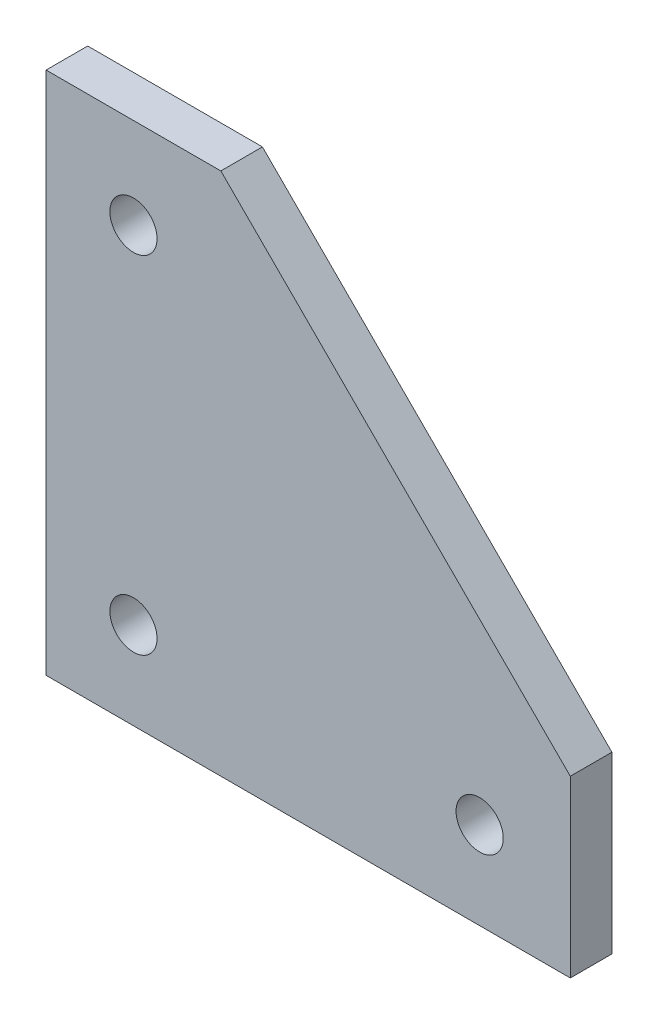
ISO-10303-21;
HEADER;
FILE_DESCRIPTION(('STEP AP214'),'2;1');
FILE_NAME('part.step','',(''),(''),'','','');
FILE_SCHEMA(('AUTOMOTIVE_DESIGN { 1 0 10303 214 1 1 1 1 }'));
ENDSEC;
DATA;
#1=APPLICATION_CONTEXT('core data for automotive mechanical design processes');
#2=APPLICATION_PROTOCOL_DEFINITION('international standard','automotive_design',2000,#1);
#3=PRODUCT_CONTEXT('',#1,'mechanical');
#4=PRODUCT('Part','Part','',(#3));
#5=PRODUCT_RELATED_PRODUCT_CATEGORY('part','',(#4));
#6=PRODUCT_DEFINITION_FORMATION('','',#4);
#7=PRODUCT_DEFINITION_CONTEXT('part definition',#1,'design');
#8=PRODUCT_DEFINITION('design','',#6,#7);
#9=PRODUCT_DEFINITION_SHAPE('','',#8);
#10=(LENGTH_UNIT() NAMED_UNIT(*) SI_UNIT(.MILLI.,.METRE.));
#11=(NAMED_UNIT(*) PLANE_ANGLE_UNIT() SI_UNIT($,.RADIAN.));
#12=(NAMED_UNIT(*) SI_UNIT($,.STERADIAN.) SOLID_ANGLE_UNIT());
#13=UNCERTAINTY_MEASURE_WITH_UNIT(LENGTH_MEASURE(1.E-05),#10,'distance_accuracy_value','');
#14=(GEOMETRIC_REPRESENTATION_CONTEXT(3) GLOBAL_UNCERTAINTY_ASSIGNED_CONTEXT((#13)) GLOBAL_UNIT_ASSIGNED_CONTEXT((#10,
#11,#12)) REPRESENTATION_CONTEXT('',''));
#15=CARTESIAN_POINT('',(0.,0.,0.));
#16=DIRECTION('',(0.,0.,1.));
#17=DIRECTION('',(1.,0.,0.));
#18=AXIS2_PLACEMENT_3D('',#15,#16,#17);
#19=CARTESIAN_POINT('',(0.,0.,2.38125));
#20=DIRECTION('',(0.,0.,-1.));
#21=DIRECTION('',(-1.,0.,0.));
#22=AXIS2_PLACEMENT_3D('',#19,#20,#21);
#23=PLANE('',#22);
#24=DIRECTION('',(1.,0.,0.));
#25=VECTOR('',#24,1.);
#26=CARTESIAN_POINT('',(60.,0.,2.38125));
#27=LINE('',#26,#25);
#28=CARTESIAN_POINT('',(0.,0.,2.38125));
#29=VERTEX_POINT('',#28);
#30=CARTESIAN_POINT('',(60.,0.,2.38125));
#31=VERTEX_POINT('',#30);
#32=EDGE_CURVE('E121',#29,#31,#27,.T.);
#33=ORIENTED_EDGE('',*,*,#32,.T.);
#34=DIRECTION('',(0.,1.,0.));
#35=VECTOR('',#34,1.);
#36=CARTESIAN_POINT('',(60.,20.,2.38125));
#37=LINE('',#36,#35);
#38=CARTESIAN_POINT('',(60.,20.,2.38125));
#39=VERTEX_POINT('',#38);
#40=EDGE_CURVE('E88',#31,#39,#37,.T.);
#41=ORIENTED_EDGE('',*,*,#40,.T.);
#42=DIRECTION('',(-0.707106781186548,0.707106781186548,0.));
#43=VECTOR('',#42,1.);
#44=CARTESIAN_POINT('',(60.,20.,2.38125));
#45=LINE('',#44,#43);
#46=CARTESIAN_POINT('',(20.,60.,2.38125));
#47=VERTEX_POINT('',#46);
#48=EDGE_CURVE('E92',#39,#47,#45,.T.);
#49=ORIENTED_EDGE('',*,*,#48,.T.);
#50=DIRECTION('',(-1.,0.,0.));
#51=VECTOR('',#50,1.);
#52=CARTESIAN_POINT('',(0.,60.,2.38125));
#53=LINE('',#52,#51);
#54=CARTESIAN_POINT('',(0.,60.,2.38125));
#55=VERTEX_POINT('',#54);
#56=EDGE_CURVE('E96',#47,#55,#53,.T.);
#57=ORIENTED_EDGE('',*,*,#56,.T.);
#58=DIRECTION('',(0.,-1.,0.));
#59=VECTOR('',#58,1.);
#60=CARTESIAN_POINT('',(0.,0.,2.38125));
#61=LINE('',#60,#59);
#62=EDGE_CURVE('E54',#55,#29,#61,.T.);
#63=ORIENTED_EDGE('',*,*,#62,.T.);
#64=EDGE_LOOP('',(#33,#41,#49,#57,#63));
#65=FACE_BOUND('',#64,.T.);
#66=CARTESIAN_POINT('',(10.,10.,2.38125));
#67=DIRECTION('',(0.,0.,1.));
#68=DIRECTION('',(1.,0.,0.));
#69=AXIS2_PLACEMENT_3D('',#66,#67,#68);
#70=CIRCLE('',#69,2.7);
#71=CARTESIAN_POINT('',(7.3,10.,2.38125));
#72=VERTEX_POINT('',#71);
#73=EDGE_CURVE('E116',#72,#72,#70,.T.);
#74=ORIENTED_EDGE('',*,*,#73,.F.);
#75=EDGE_LOOP('',(#74));
#76=FACE_BOUND('',#75,.T.);
#77=CARTESIAN_POINT('',(49.624,10.,2.38125));
#78=DIRECTION('',(0.,0.,1.));
#79=DIRECTION('',(1.,0.,0.));
#80=AXIS2_PLACEMENT_3D('',#77,#78,#79);
#81=CIRCLE('',#80,2.7);
#82=CARTESIAN_POINT('',(46.924,10.,2.38125));
#83=VERTEX_POINT('',#82);
#84=EDGE_CURVE('E170',#83,#83,#81,.T.);
#85=ORIENTED_EDGE('',*,*,#84,.F.);
#86=EDGE_LOOP('',(#85));
#87=FACE_BOUND('',#86,.T.);
#88=CARTESIAN_POINT('',(10.,49.624,2.38125));
#89=DIRECTION('',(0.,0.,1.));
#90=DIRECTION('',(1.,0.,0.));
#91=AXIS2_PLACEMENT_3D('',#88,#89,#90);
#92=CIRCLE('',#91,2.7);
#93=CARTESIAN_POINT('',(7.3,49.624,2.38125));
#94=VERTEX_POINT('',#93);
#95=EDGE_CURVE('E161',#94,#94,#92,.T.);
#96=ORIENTED_EDGE('',*,*,#95,.F.);
#97=EDGE_LOOP('',(#96));
#98=FACE_BOUND('',#97,.T.);
#99=ADVANCED_FACE('F37',(#65,#76,#87,#98),#23,.F.);
#100=CARTESIAN_POINT('',(0.,0.,-2.38125));
#101=DIRECTION('',(0.,0.,-1.));
#102=DIRECTION('',(-1.,0.,0.));
#103=AXIS2_PLACEMENT_3D('',#100,#101,#102);
#104=PLANE('',#103);
#105=CARTESIAN_POINT('',(49.624,10.,-2.38125));
#106=DIRECTION('',(0.,0.,1.));
#107=DIRECTION('',(1.,0.,0.));
#108=AXIS2_PLACEMENT_3D('',#105,#106,#107);
#109=CIRCLE('',#108,2.7);
#110=CARTESIAN_POINT('',(46.924,10.,-2.38125));
#111=VERTEX_POINT('',#110);
#112=EDGE_CURVE('E167',#111,#111,#109,.T.);
#113=ORIENTED_EDGE('',*,*,#112,.T.);
#114=EDGE_LOOP('',(#113));
#115=FACE_BOUND('',#114,.T.);
#116=DIRECTION('',(1.,0.,0.));
#117=VECTOR('',#116,1.);
#118=CARTESIAN_POINT('',(60.,0.,-2.38125));
#119=LINE('',#118,#117);
#120=CARTESIAN_POINT('',(0.,0.,-2.38125));
#121=VERTEX_POINT('',#120);
#122=CARTESIAN_POINT('',(60.,0.,-2.38125));
#123=VERTEX_POINT('',#122);
#124=EDGE_CURVE('E112',#121,#123,#119,.T.);
#125=ORIENTED_EDGE('',*,*,#124,.F.);
#126=DIRECTION('',(0.,-1.,0.));
#127=VECTOR('',#126,1.);
#128=CARTESIAN_POINT('',(0.,0.,-2.38125));
#129=LINE('',#128,#127);
#130=CARTESIAN_POINT('',(0.,60.,-2.38125));
#131=VERTEX_POINT('',#130);
#132=EDGE_CURVE('E80',#131,#121,#129,.T.);
#133=ORIENTED_EDGE('',*,*,#132,.F.);
#134=DIRECTION('',(-1.,0.,0.));
#135=VECTOR('',#134,1.);
#136=CARTESIAN_POINT('',(0.,60.,-2.38125));
#137=LINE('',#136,#135);
#138=CARTESIAN_POINT('',(20.,60.,-2.38125));
#139=VERTEX_POINT('',#138);
#140=EDGE_CURVE('E74',#139,#131,#137,.T.);
#141=ORIENTED_EDGE('',*,*,#140,.F.);
#142=DIRECTION('',(-0.707106781186548,0.707106781186548,0.));
#143=VECTOR('',#142,1.);
#144=CARTESIAN_POINT('',(60.,20.,-2.38125));
#145=LINE('',#144,#143);
#146=CARTESIAN_POINT('',(60.,20.,-2.38125));
#147=VERTEX_POINT('',#146);
#148=EDGE_CURVE('E103',#147,#139,#145,.T.);
#149=ORIENTED_EDGE('',*,*,#148,.F.);
#150=DIRECTION('',(0.,1.,0.));
#151=VECTOR('',#150,1.);
#152=CARTESIAN_POINT('',(60.,20.,-2.38125));
#153=LINE('',#152,#151);
#154=EDGE_CURVE('E115',#123,#147,#153,.T.);
#155=ORIENTED_EDGE('',*,*,#154,.F.);
#156=EDGE_LOOP('',(#125,#133,#141,#149,#155));
#157=FACE_BOUND('',#156,.T.);
#158=CARTESIAN_POINT('',(10.,10.,-2.38125));
#159=DIRECTION('',(0.,0.,1.));
#160=DIRECTION('',(1.,0.,0.));
#161=AXIS2_PLACEMENT_3D('',#158,#159,#160);
#162=CIRCLE('',#161,2.7);
#163=CARTESIAN_POINT('',(7.3,10.,-2.38125));
#164=VERTEX_POINT('',#163);
#165=EDGE_CURVE('E173',#164,#164,#162,.T.);
#166=ORIENTED_EDGE('',*,*,#165,.T.);
#167=EDGE_LOOP('',(#166));
#168=FACE_BOUND('',#167,.T.);
#169=CARTESIAN_POINT('',(10.,49.624,-2.38125));
#170=DIRECTION('',(0.,0.,1.));
#171=DIRECTION('',(1.,0.,0.));
#172=AXIS2_PLACEMENT_3D('',#169,#170,#171);
#173=CIRCLE('',#172,2.7);
#174=CARTESIAN_POINT('',(7.3,49.624,-2.38125));
#175=VERTEX_POINT('',#174);
#176=EDGE_CURVE('E164',#175,#175,#173,.T.);
#177=ORIENTED_EDGE('',*,*,#176,.T.);
#178=EDGE_LOOP('',(#177));
#179=FACE_BOUND('',#178,.T.);
#180=ADVANCED_FACE('F125',(#115,#157,#168,#179),#104,.T.);
#181=CARTESIAN_POINT('',(60.,0.,2.38125));
#182=DIRECTION('',(0.,1.,0.));
#183=DIRECTION('',(-1.,0.,0.));
#184=AXIS2_PLACEMENT_3D('',#181,#182,#183);
#185=PLANE('',#184);
#186=ORIENTED_EDGE('',*,*,#124,.T.);
#187=DIRECTION('',(0.,0.,-1.));
#188=VECTOR('',#187,1.);
#189=CARTESIAN_POINT('',(60.,0.,2.38125));
#190=LINE('',#189,#188);
#191=EDGE_CURVE('E11',#31,#123,#190,.T.);
#192=ORIENTED_EDGE('',*,*,#191,.F.);
#193=ORIENTED_EDGE('',*,*,#32,.F.);
#194=DIRECTION('',(0.,0.,-1.));
#195=VECTOR('',#194,1.);
#196=CARTESIAN_POINT('',(0.,0.,2.38125));
#197=LINE('',#196,#195);
#198=EDGE_CURVE('E108',#29,#121,#197,.T.);
#199=ORIENTED_EDGE('',*,*,#198,.T.);
#200=EDGE_LOOP('',(#186,#192,#193,#199));
#201=FACE_BOUND('',#200,.T.);
#202=ADVANCED_FACE('F39',(#201),#185,.F.);
#203=CARTESIAN_POINT('',(60.,20.,2.38125));
#204=DIRECTION('',(-1.,0.,0.));
#205=DIRECTION('',(0.,0.,1.));
#206=AXIS2_PLACEMENT_3D('',#203,#204,#205);
#207=PLANE('',#206);
#208=ORIENTED_EDGE('',*,*,#154,.T.);
#209=DIRECTION('',(0.,0.,-1.));
#210=VECTOR('',#209,1.);
#211=CARTESIAN_POINT('',(60.,20.,2.38125));
#212=LINE('',#211,#210);
#213=EDGE_CURVE('E46',#39,#147,#212,.T.);
#214=ORIENTED_EDGE('',*,*,#213,.F.);
#215=ORIENTED_EDGE('',*,*,#40,.F.);
#216=ORIENTED_EDGE('',*,*,#191,.T.);
#217=EDGE_LOOP('',(#208,#214,#215,#216));
#218=FACE_BOUND('',#217,.T.);
#219=ADVANCED_FACE('F215',(#218),#207,.F.);
#220=CARTESIAN_POINT('',(60.,20.,2.38125));
#221=DIRECTION('',(-0.707106781186548,-0.707106781186548,0.));
#222=DIRECTION('',(0.707106781186548,-0.707106781186548,0.));
#223=AXIS2_PLACEMENT_3D('',#220,#221,#222);
#224=PLANE('',#223);
#225=ORIENTED_EDGE('',*,*,#148,.T.);
#226=DIRECTION('',(0.,0.,-1.));
#227=VECTOR('',#226,1.);
#228=CARTESIAN_POINT('',(20.,60.,2.38125));
#229=LINE('',#228,#227);
#230=EDGE_CURVE('E100',#47,#139,#229,.T.);
#231=ORIENTED_EDGE('',*,*,#230,.F.);
#232=ORIENTED_EDGE('',*,*,#48,.F.);
#233=ORIENTED_EDGE('',*,*,#213,.T.);
#234=EDGE_LOOP('',(#225,#231,#232,#233));
#235=FACE_BOUND('',#234,.T.);
#236=ADVANCED_FACE('F101',(#235),#224,.F.);
#237=CARTESIAN_POINT('',(0.,60.,2.38125));
#238=DIRECTION('',(0.,-1.,0.));
#239=DIRECTION('',(0.,0.,-1.));
#240=AXIS2_PLACEMENT_3D('',#237,#238,#239);
#241=PLANE('',#240);
#242=ORIENTED_EDGE('',*,*,#140,.T.);
#243=DIRECTION('',(0.,0.,-1.));
#244=VECTOR('',#243,1.);
#245=CARTESIAN_POINT('',(0.,60.,2.38125));
#246=LINE('',#245,#244);
#247=EDGE_CURVE('E104',#55,#131,#246,.T.);
#248=ORIENTED_EDGE('',*,*,#247,.F.);
#249=ORIENTED_EDGE('',*,*,#56,.F.);
#250=ORIENTED_EDGE('',*,*,#230,.T.);
#251=EDGE_LOOP('',(#242,#248,#249,#250));
#252=FACE_BOUND('',#251,.T.);
#253=ADVANCED_FACE('F106',(#252),#241,.F.);
#254=CARTESIAN_POINT('',(0.,0.,2.38125));
#255=DIRECTION('',(1.,0.,0.));
#256=DIRECTION('',(0.,0.,-1.));
#257=AXIS2_PLACEMENT_3D('',#254,#255,#256);
#258=PLANE('',#257);
#259=ORIENTED_EDGE('',*,*,#132,.T.);
#260=ORIENTED_EDGE('',*,*,#198,.F.);
#261=ORIENTED_EDGE('',*,*,#62,.F.);
#262=ORIENTED_EDGE('',*,*,#247,.T.);
#263=EDGE_LOOP('',(#259,#260,#261,#262));
#264=FACE_BOUND('',#263,.T.);
#265=ADVANCED_FACE('F130',(#264),#258,.F.);
#266=CARTESIAN_POINT('',(10.,10.,2.38125));
#267=DIRECTION('',(0.,0.,-1.));
#268=DIRECTION('',(-1.,0.,0.));
#269=AXIS2_PLACEMENT_3D('',#266,#267,#268);
#270=CYLINDRICAL_SURFACE('',#269,2.7);
#271=CARTESIAN_POINT('',(7.3,10.,2.38125));
#272=CARTESIAN_POINT('',(7.3,10.,2.331640625));
#273=CARTESIAN_POINT('',(7.3,10.,2.28203125));
#274=CARTESIAN_POINT('',(7.3,10.,2.1828125));
#275=CARTESIAN_POINT('',(7.3,10.,2.133203125));
#276=CARTESIAN_POINT('',(7.3,10.,2.033984375));
#277=CARTESIAN_POINT('',(7.3,10.,1.984375));
#278=CARTESIAN_POINT('',(7.3,10.,1.88515625));
#279=CARTESIAN_POINT('',(7.3,10.,1.835546875));
#280=CARTESIAN_POINT('',(7.3,10.,1.736328125));
#281=CARTESIAN_POINT('',(7.3,10.,1.68671875));
#282=CARTESIAN_POINT('',(7.3,10.,1.5875));
#283=CARTESIAN_POINT('',(7.3,10.,1.537890625));
#284=CARTESIAN_POINT('',(7.3,10.,1.438671875));
#285=CARTESIAN_POINT('',(7.3,10.,1.3890625));
#286=CARTESIAN_POINT('',(7.3,10.,1.28984375));
#287=CARTESIAN_POINT('',(7.3,10.,1.240234375));
#288=CARTESIAN_POINT('',(7.3,10.,1.141015625));
#289=CARTESIAN_POINT('',(7.3,10.,1.09140625));
#290=CARTESIAN_POINT('',(7.3,10.,0.9921875));
#291=CARTESIAN_POINT('',(7.3,10.,0.942578125));
#292=CARTESIAN_POINT('',(7.3,10.,0.843359375));
#293=CARTESIAN_POINT('',(7.3,10.,0.79375));
#294=CARTESIAN_POINT('',(7.3,10.,0.69453125));
#295=CARTESIAN_POINT('',(7.3,10.,0.644921875));
#296=CARTESIAN_POINT('',(7.3,10.,0.545703125));
#297=CARTESIAN_POINT('',(7.3,10.,0.49609375));
#298=CARTESIAN_POINT('',(7.3,10.,0.396875));
#299=CARTESIAN_POINT('',(7.3,10.,0.347265625));
#300=CARTESIAN_POINT('',(7.3,10.,0.248046875));
#301=CARTESIAN_POINT('',(7.3,10.,0.1984375));
#302=CARTESIAN_POINT('',(7.3,10.,0.09921875));
#303=CARTESIAN_POINT('',(7.3,10.,0.049609375));
#304=CARTESIAN_POINT('',(7.3,10.,-0.049609375));
#305=CARTESIAN_POINT('',(7.3,10.,-0.09921875));
#306=CARTESIAN_POINT('',(7.3,10.,-0.1984375));
#307=CARTESIAN_POINT('',(7.3,10.,-0.248046875));
#308=CARTESIAN_POINT('',(7.3,10.,-0.347265625));
#309=CARTESIAN_POINT('',(7.3,10.,-0.396875));
#310=CARTESIAN_POINT('',(7.3,10.,-0.49609375));
#311=CARTESIAN_POINT('',(7.3,10.,-0.545703125));
#312=CARTESIAN_POINT('',(7.3,10.,-0.644921875));
#313=CARTESIAN_POINT('',(7.3,10.,-0.69453125));
#314=CARTESIAN_POINT('',(7.3,10.,-0.79375));
#315=CARTESIAN_POINT('',(7.3,10.,-0.843359375));
#316=CARTESIAN_POINT('',(7.3,10.,-0.942578125));
#317=CARTESIAN_POINT('',(7.3,10.,-0.9921875));
#318=CARTESIAN_POINT('',(7.3,10.,-1.09140625));
#319=CARTESIAN_POINT('',(7.3,10.,-1.141015625));
#320=CARTESIAN_POINT('',(7.3,10.,-1.240234375));
#321=CARTESIAN_POINT('',(7.3,10.,-1.28984375));
#322=CARTESIAN_POINT('',(7.3,10.,-1.3890625));
#323=CARTESIAN_POINT('',(7.3,10.,-1.438671875));
#324=CARTESIAN_POINT('',(7.3,10.,-1.537890625));
#325=CARTESIAN_POINT('',(7.3,10.,-1.5875));
#326=CARTESIAN_POINT('',(7.3,10.,-1.68671875));
#327=CARTESIAN_POINT('',(7.3,10.,-1.736328125));
#328=CARTESIAN_POINT('',(7.3,10.,-1.835546875));
#329=CARTESIAN_POINT('',(7.3,10.,-1.88515625));
#330=CARTESIAN_POINT('',(7.3,10.,-1.984375));
#331=CARTESIAN_POINT('',(7.3,10.,-2.033984375));
#332=CARTESIAN_POINT('',(7.3,10.,-2.133203125));
#333=CARTESIAN_POINT('',(7.3,10.,-2.1828125));
#334=CARTESIAN_POINT('',(7.3,10.,-2.28203125));
#335=CARTESIAN_POINT('',(7.3,10.,-2.331640625));
#336=CARTESIAN_POINT('',(7.3,10.,-2.38125));
#337=B_SPLINE_CURVE_WITH_KNOTS('',3,(#271,#272,#273,#274,#275,#276,#277,#278,#279,#280,#281,
#282,#283,#284,#285,#286,#287,#288,#289,#290,#291,#292,#293,#294,#295,#296,#297,#298,#299,#300,
#301,#302,#303,#304,#305,#306,#307,#308,#309,#310,#311,#312,#313,#314,#315,#316,#317,#318,#319,
#320,#321,#322,#323,#324,#325,#326,#327,#328,#329,#330,#331,#332,#333,#334,#335,#336),
.UNSPECIFIED.,.F.,.F.,(4,2,2,2,2,2,2,2,2,2,2,2,2,2,2,2,2,2,2,2,2,2,2,2,2,2,2,2,2,2,2,2,4),(0.,
0.148828125,0.29765625,0.446484375,0.5953125,0.744140625,0.89296875,1.041796875,1.190625,
1.339453125,1.48828125,1.637109375,1.7859375,1.934765625,2.08359375,2.232421875,2.38125,
2.530078125,2.67890625,2.827734375,2.9765625,3.125390625,3.27421875,3.423046875,3.571875,
3.720703125,3.86953125,4.018359375,4.1671875,4.316015625,4.46484375,4.613671875,4.7625),.UNSPECIFIED.);
#338=EDGE_CURVE('BSEAM132',#72,#164,#337,.T.);
#339=ORIENTED_EDGE('',*,*,#73,.T.);
#340=ORIENTED_EDGE('',*,*,#165,.F.);
#341=ORIENTED_EDGE('',*,*,#338,.T.);
#342=ORIENTED_EDGE('',*,*,#338,.F.);
#343=EDGE_LOOP('',(#339,#341,#340,#342));
#344=FACE_BOUND('',#343,.T.);
#345=ADVANCED_FACE('F132',(#344),#270,.F.);
#346=CARTESIAN_POINT('',(49.624,10.,2.38125));
#347=DIRECTION('',(0.,0.,-1.));
#348=DIRECTION('',(-1.,0.,0.));
#349=AXIS2_PLACEMENT_3D('',#346,#347,#348);
#350=CYLINDRICAL_SURFACE('',#349,2.7);
#351=CARTESIAN_POINT('',(46.924,10.,2.38125));
#352=CARTESIAN_POINT('',(46.924,10.,2.331640625));
#353=CARTESIAN_POINT('',(46.924,10.,2.28203125));
#354=CARTESIAN_POINT('',(46.924,10.,2.1828125));
#355=CARTESIAN_POINT('',(46.924,10.,2.133203125));
#356=CARTESIAN_POINT('',(46.924,10.,2.033984375));
#357=CARTESIAN_POINT('',(46.924,10.,1.984375));
#358=CARTESIAN_POINT('',(46.924,10.,1.88515625));
#359=CARTESIAN_POINT('',(46.924,10.,1.835546875));
#360=CARTESIAN_POINT('',(46.924,10.,1.736328125));
#361=CARTESIAN_POINT('',(46.924,10.,1.68671875));
#362=CARTESIAN_POINT('',(46.924,10.,1.5875));
#363=CARTESIAN_POINT('',(46.924,10.,1.537890625));
#364=CARTESIAN_POINT('',(46.924,10.,1.438671875));
#365=CARTESIAN_POINT('',(46.924,10.,1.3890625));
#366=CARTESIAN_POINT('',(46.924,10.,1.28984375));
#367=CARTESIAN_POINT('',(46.924,10.,1.240234375));
#368=CARTESIAN_POINT('',(46.924,10.,1.141015625));
#369=CARTESIAN_POINT('',(46.924,10.,1.09140625));
#370=CARTESIAN_POINT('',(46.924,10.,0.9921875));
#371=CARTESIAN_POINT('',(46.924,10.,0.942578125));
#372=CARTESIAN_POINT('',(46.924,10.,0.843359375));
#373=CARTESIAN_POINT('',(46.924,10.,0.79375));
#374=CARTESIAN_POINT('',(46.924,10.,0.69453125));
#375=CARTESIAN_POINT('',(46.924,10.,0.644921875));
#376=CARTESIAN_POINT('',(46.924,10.,0.545703125));
#377=CARTESIAN_POINT('',(46.924,10.,0.49609375));
#378=CARTESIAN_POINT('',(46.924,10.,0.396875));
#379=CARTESIAN_POINT('',(46.924,10.,0.347265625));
#380=CARTESIAN_POINT('',(46.924,10.,0.248046875));
#381=CARTESIAN_POINT('',(46.924,10.,0.1984375));
#382=CARTESIAN_POINT('',(46.924,10.,0.09921875));
#383=CARTESIAN_POINT('',(46.924,10.,0.049609375));
#384=CARTESIAN_POINT('',(46.924,10.,-0.049609375));
#385=CARTESIAN_POINT('',(46.924,10.,-0.09921875));
#386=CARTESIAN_POINT('',(46.924,10.,-0.1984375));
#387=CARTESIAN_POINT('',(46.924,10.,-0.248046875));
#388=CARTESIAN_POINT('',(46.924,10.,-0.347265625));
#389=CARTESIAN_POINT('',(46.924,10.,-0.396875));
#390=CARTESIAN_POINT('',(46.924,10.,-0.49609375));
#391=CARTESIAN_POINT('',(46.924,10.,-0.545703125));
#392=CARTESIAN_POINT('',(46.924,10.,-0.644921875));
#393=CARTESIAN_POINT('',(46.924,10.,-0.69453125));
#394=CARTESIAN_POINT('',(46.924,10.,-0.79375));
#395=CARTESIAN_POINT('',(46.924,10.,-0.843359375));
#396=CARTESIAN_POINT('',(46.924,10.,-0.942578125));
#397=CARTESIAN_POINT('',(46.924,10.,-0.9921875));
#398=CARTESIAN_POINT('',(46.924,10.,-1.09140625));
#399=CARTESIAN_POINT('',(46.924,10.,-1.141015625));
#400=CARTESIAN_POINT('',(46.924,10.,-1.240234375));
#401=CARTESIAN_POINT('',(46.924,10.,-1.28984375));
#402=CARTESIAN_POINT('',(46.924,10.,-1.3890625));
#403=CARTESIAN_POINT('',(46.924,10.,-1.438671875));
#404=CARTESIAN_POINT('',(46.924,10.,-1.537890625));
#405=CARTESIAN_POINT('',(46.924,10.,-1.5875));
#406=CARTESIAN_POINT('',(46.924,10.,-1.68671875));
#407=CARTESIAN_POINT('',(46.924,10.,-1.736328125));
#408=CARTESIAN_POINT('',(46.924,10.,-1.835546875));
#409=CARTESIAN_POINT('',(46.924,10.,-1.88515625));
#410=CARTESIAN_POINT('',(46.924,10.,-1.984375));
#411=CARTESIAN_POINT('',(46.924,10.,-2.033984375));
#412=CARTESIAN_POINT('',(46.924,10.,-2.133203125));
#413=CARTESIAN_POINT('',(46.924,10.,-2.1828125));
#414=CARTESIAN_POINT('',(46.924,10.,-2.28203125));
#415=CARTESIAN_POINT('',(46.924,10.,-2.331640625));
#416=CARTESIAN_POINT('',(46.924,10.,-2.38125));
#417=B_SPLINE_CURVE_WITH_KNOTS('',3,(#351,#352,#353,#354,#355,#356,#357,#358,#359,#360,#361,
#362,#363,#364,#365,#366,#367,#368,#369,#370,#371,#372,#373,#374,#375,#376,#377,#378,#379,#380,
#381,#382,#383,#384,#385,#386,#387,#388,#389,#390,#391,#392,#393,#394,#395,#396,#397,#398,#399,
#400,#401,#402,#403,#404,#405,#406,#407,#408,#409,#410,#411,#412,#413,#414,#415,#416),
.UNSPECIFIED.,.F.,.F.,(4,2,2,2,2,2,2,2,2,2,2,2,2,2,2,2,2,2,2,2,2,2,2,2,2,2,2,2,2,2,2,2,4),(0.,
0.148828125,0.29765625,0.446484375,0.5953125,0.744140625,0.89296875,1.041796875,1.190625,
1.339453125,1.48828125,1.637109375,1.7859375,1.934765625,2.08359375,2.232421875,2.38125,
2.530078125,2.67890625,2.827734375,2.9765625,3.125390625,3.27421875,3.423046875,3.571875,
3.720703125,3.86953125,4.018359375,4.1671875,4.316015625,4.46484375,4.613671875,4.7625),.UNSPECIFIED.);
#418=EDGE_CURVE('BSEAM138',#83,#111,#417,.T.);
#419=ORIENTED_EDGE('',*,*,#84,.T.);
#420=ORIENTED_EDGE('',*,*,#112,.F.);
#421=ORIENTED_EDGE('',*,*,#418,.T.);
#422=ORIENTED_EDGE('',*,*,#418,.F.);
#423=EDGE_LOOP('',(#419,#421,#420,#422));
#424=FACE_BOUND('',#423,.T.);
#425=ADVANCED_FACE('F138',(#424),#350,.F.);
#426=CARTESIAN_POINT('',(10.,49.624,2.38125));
#427=DIRECTION('',(0.,0.,-1.));
#428=DIRECTION('',(-1.,0.,0.));
#429=AXIS2_PLACEMENT_3D('',#426,#427,#428);
#430=CYLINDRICAL_SURFACE('',#429,2.7);
#431=CARTESIAN_POINT('',(7.3,49.624,2.38125));
#432=CARTESIAN_POINT('',(7.3,49.624,2.331640625));
#433=CARTESIAN_POINT('',(7.3,49.624,2.28203125));
#434=CARTESIAN_POINT('',(7.3,49.624,2.1828125));
#435=CARTESIAN_POINT('',(7.3,49.624,2.133203125));
#436=CARTESIAN_POINT('',(7.3,49.624,2.033984375));
#437=CARTESIAN_POINT('',(7.3,49.624,1.984375));
#438=CARTESIAN_POINT('',(7.3,49.624,1.88515625));
#439=CARTESIAN_POINT('',(7.3,49.624,1.835546875));
#440=CARTESIAN_POINT('',(7.3,49.624,1.736328125));
#441=CARTESIAN_POINT('',(7.3,49.624,1.68671875));
#442=CARTESIAN_POINT('',(7.3,49.624,1.5875));
#443=CARTESIAN_POINT('',(7.3,49.624,1.537890625));
#444=CARTESIAN_POINT('',(7.3,49.624,1.438671875));
#445=CARTESIAN_POINT('',(7.3,49.624,1.3890625));
#446=CARTESIAN_POINT('',(7.3,49.624,1.28984375));
#447=CARTESIAN_POINT('',(7.3,49.624,1.240234375));
#448=CARTESIAN_POINT('',(7.3,49.624,1.141015625));
#449=CARTESIAN_POINT('',(7.3,49.624,1.09140625));
#450=CARTESIAN_POINT('',(7.3,49.624,0.9921875));
#451=CARTESIAN_POINT('',(7.3,49.624,0.942578125));
#452=CARTESIAN_POINT('',(7.3,49.624,0.843359375));
#453=CARTESIAN_POINT('',(7.3,49.624,0.79375));
#454=CARTESIAN_POINT('',(7.3,49.624,0.69453125));
#455=CARTESIAN_POINT('',(7.3,49.624,0.644921875));
#456=CARTESIAN_POINT('',(7.3,49.624,0.545703125));
#457=CARTESIAN_POINT('',(7.3,49.624,0.49609375));
#458=CARTESIAN_POINT('',(7.3,49.624,0.396875));
#459=CARTESIAN_POINT('',(7.3,49.624,0.347265625));
#460=CARTESIAN_POINT('',(7.3,49.624,0.248046875));
#461=CARTESIAN_POINT('',(7.3,49.624,0.1984375));
#462=CARTESIAN_POINT('',(7.3,49.624,0.09921875));
#463=CARTESIAN_POINT('',(7.3,49.624,0.049609375));
#464=CARTESIAN_POINT('',(7.3,49.624,-0.049609375));
#465=CARTESIAN_POINT('',(7.3,49.624,-0.09921875));
#466=CARTESIAN_POINT('',(7.3,49.624,-0.1984375));
#467=CARTESIAN_POINT('',(7.3,49.624,-0.248046875));
#468=CARTESIAN_POINT('',(7.3,49.624,-0.347265625));
#469=CARTESIAN_POINT('',(7.3,49.624,-0.396875));
#470=CARTESIAN_POINT('',(7.3,49.624,-0.49609375));
#471=CARTESIAN_POINT('',(7.3,49.624,-0.545703125));
#472=CARTESIAN_POINT('',(7.3,49.624,-0.644921875));
#473=CARTESIAN_POINT('',(7.3,49.624,-0.69453125));
#474=CARTESIAN_POINT('',(7.3,49.624,-0.79375));
#475=CARTESIAN_POINT('',(7.3,49.624,-0.843359375));
#476=CARTESIAN_POINT('',(7.3,49.624,-0.942578125));
#477=CARTESIAN_POINT('',(7.3,49.624,-0.9921875));
#478=CARTESIAN_POINT('',(7.3,49.624,-1.09140625));
#479=CARTESIAN_POINT('',(7.3,49.624,-1.141015625));
#480=CARTESIAN_POINT('',(7.3,49.624,-1.240234375));
#481=CARTESIAN_POINT('',(7.3,49.624,-1.28984375));
#482=CARTESIAN_POINT('',(7.3,49.624,-1.3890625));
#483=CARTESIAN_POINT('',(7.3,49.624,-1.438671875));
#484=CARTESIAN_POINT('',(7.3,49.624,-1.537890625));
#485=CARTESIAN_POINT('',(7.3,49.624,-1.5875));
#486=CARTESIAN_POINT('',(7.3,49.624,-1.68671875));
#487=CARTESIAN_POINT('',(7.3,49.624,-1.736328125));
#488=CARTESIAN_POINT('',(7.3,49.624,-1.835546875));
#489=CARTESIAN_POINT('',(7.3,49.624,-1.88515625));
#490=CARTESIAN_POINT('',(7.3,49.624,-1.984375));
#491=CARTESIAN_POINT('',(7.3,49.624,-2.033984375));
#492=CARTESIAN_POINT('',(7.3,49.624,-2.133203125));
#493=CARTESIAN_POINT('',(7.3,49.624,-2.1828125));
#494=CARTESIAN_POINT('',(7.3,49.624,-2.28203125));
#495=CARTESIAN_POINT('',(7.3,49.624,-2.331640625));
#496=CARTESIAN_POINT('',(7.3,49.624,-2.38125));
#497=B_SPLINE_CURVE_WITH_KNOTS('',3,(#431,#432,#433,#434,#435,#436,#437,#438,#439,#440,#441,
#442,#443,#444,#445,#446,#447,#448,#449,#450,#451,#452,#453,#454,#455,#456,#457,#458,#459,#460,
#461,#462,#463,#464,#465,#466,#467,#468,#469,#470,#471,#472,#473,#474,#475,#476,#477,#478,#479,
#480,#481,#482,#483,#484,#485,#486,#487,#488,#489,#490,#491,#492,#493,#494,#495,#496),
.UNSPECIFIED.,.F.,.F.,(4,2,2,2,2,2,2,2,2,2,2,2,2,2,2,2,2,2,2,2,2,2,2,2,2,2,2,2,2,2,2,2,4),(0.,
0.148828125,0.29765625,0.446484375,0.5953125,0.744140625,0.89296875,1.041796875,1.190625,
1.339453125,1.48828125,1.637109375,1.7859375,1.934765625,2.08359375,2.232421875,2.38125,
2.530078125,2.67890625,2.827734375,2.9765625,3.125390625,3.27421875,3.423046875,3.571875,
3.720703125,3.86953125,4.018359375,4.1671875,4.316015625,4.46484375,4.613671875,4.7625),.UNSPECIFIED.);
#498=EDGE_CURVE('BSEAM152',#94,#175,#497,.T.);
#499=ORIENTED_EDGE('',*,*,#95,.T.);
#500=ORIENTED_EDGE('',*,*,#176,.F.);
#501=ORIENTED_EDGE('',*,*,#498,.T.);
#502=ORIENTED_EDGE('',*,*,#498,.F.);
#503=EDGE_LOOP('',(#499,#501,#500,#502));
#504=FACE_BOUND('',#503,.T.);
#505=ADVANCED_FACE('F152',(#504),#430,.F.);
#506=CLOSED_SHELL('',(#99,#180,#202,#219,#236,#253,#265,#345,#425,#505));
#507=MANIFOLD_SOLID_BREP('B2',#506);
#508=ADVANCED_BREP_SHAPE_REPRESENTATION('',(#18,#507),#14);
#509=SHAPE_DEFINITION_REPRESENTATION(#9,#508);
ENDSEC;
END-ISO-10303-21;
